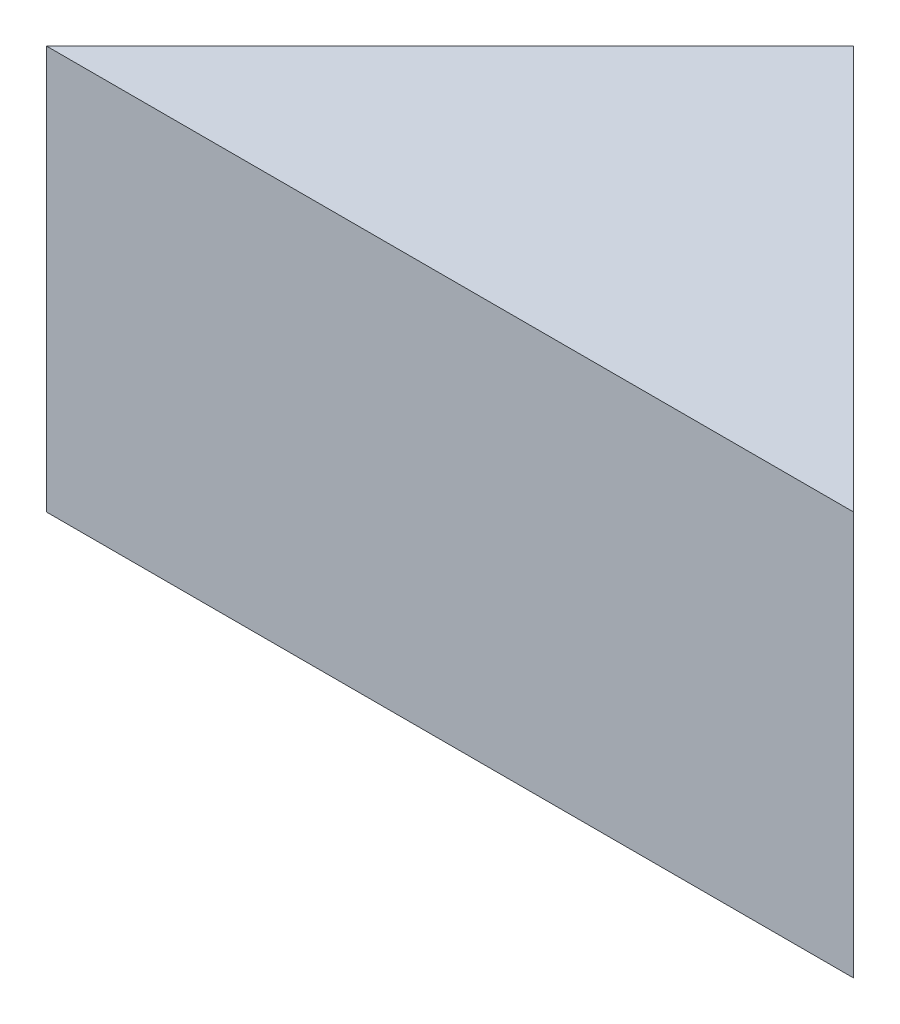
ISO-10303-21;
HEADER;
FILE_DESCRIPTION(('STEP AP214'),'2;1');
FILE_NAME('part.step','',(''),(''),'','','');
FILE_SCHEMA(('AUTOMOTIVE_DESIGN { 1 0 10303 214 1 1 1 1 }'));
ENDSEC;
DATA;
#1=APPLICATION_CONTEXT('core data for automotive mechanical design processes');
#2=APPLICATION_PROTOCOL_DEFINITION('international standard','automotive_design',2000,#1);
#3=PRODUCT_CONTEXT('',#1,'mechanical');
#4=PRODUCT('Part','Part','',(#3));
#5=PRODUCT_RELATED_PRODUCT_CATEGORY('part','',(#4));
#6=PRODUCT_DEFINITION_FORMATION('','',#4);
#7=PRODUCT_DEFINITION_CONTEXT('part definition',#1,'design');
#8=PRODUCT_DEFINITION('design','',#6,#7);
#9=PRODUCT_DEFINITION_SHAPE('','',#8);
#10=(LENGTH_UNIT() NAMED_UNIT(*) SI_UNIT(.MILLI.,.METRE.));
#11=(NAMED_UNIT(*) PLANE_ANGLE_UNIT() SI_UNIT($,.RADIAN.));
#12=(NAMED_UNIT(*) SI_UNIT($,.STERADIAN.) SOLID_ANGLE_UNIT());
#13=UNCERTAINTY_MEASURE_WITH_UNIT(LENGTH_MEASURE(1.E-05),#10,'distance_accuracy_value','');
#14=(GEOMETRIC_REPRESENTATION_CONTEXT(3) GLOBAL_UNCERTAINTY_ASSIGNED_CONTEXT((#13)) GLOBAL_UNIT_ASSIGNED_CONTEXT((#10,
#11,#12)) REPRESENTATION_CONTEXT('',''));
#15=CARTESIAN_POINT('',(0.,0.,0.));
#16=DIRECTION('',(0.,0.,1.));
#17=DIRECTION('',(1.,0.,0.));
#18=AXIS2_PLACEMENT_3D('',#15,#16,#17);
#19=CARTESIAN_POINT('',(0.,20.,0.));
#20=DIRECTION('',(0.,0.,-1.));
#21=DIRECTION('',(-1.,0.,0.));
#22=AXIS2_PLACEMENT_3D('',#19,#20,#21);
#23=PLANE('',#22);
#24=DIRECTION('',(1.,0.,0.));
#25=VECTOR('',#24,1.);
#26=CARTESIAN_POINT('',(0.,0.,0.));
#27=LINE('',#26,#25);
#28=CARTESIAN_POINT('',(-20.,0.,0.));
#29=VERTEX_POINT('',#28);
#30=CARTESIAN_POINT('',(20.,0.,0.));
#31=VERTEX_POINT('',#30);
#32=EDGE_CURVE('E90',#29,#31,#27,.T.);
#33=ORIENTED_EDGE('',*,*,#32,.T.);
#34=DIRECTION('',(0.,-1.,0.));
#35=VECTOR('',#34,1.);
#36=CARTESIAN_POINT('',(20.,20.,0.));
#37=LINE('',#36,#35);
#38=CARTESIAN_POINT('',(20.,20.,0.));
#39=VERTEX_POINT('',#38);
#40=EDGE_CURVE('E11',#39,#31,#37,.T.);
#41=ORIENTED_EDGE('',*,*,#40,.F.);
#42=DIRECTION('',(1.,0.,0.));
#43=VECTOR('',#42,1.);
#44=CARTESIAN_POINT('',(0.,20.,0.));
#45=LINE('',#44,#43);
#46=CARTESIAN_POINT('',(-20.,20.,0.));
#47=VERTEX_POINT('',#46);
#48=EDGE_CURVE('E84',#47,#39,#45,.T.);
#49=ORIENTED_EDGE('',*,*,#48,.F.);
#50=DIRECTION('',(0.,-1.,0.));
#51=VECTOR('',#50,1.);
#52=CARTESIAN_POINT('',(-20.,20.,0.));
#53=LINE('',#52,#51);
#54=EDGE_CURVE('E58',#47,#29,#53,.T.);
#55=ORIENTED_EDGE('',*,*,#54,.T.);
#56=EDGE_LOOP('',(#33,#41,#49,#55));
#57=FACE_BOUND('',#56,.T.);
#58=ADVANCED_FACE('F41',(#57),#23,.F.);
#59=CARTESIAN_POINT('',(9.9999999999999,20.,-10.));
#60=DIRECTION('',(-0.707106781186544,0.,0.707106781186551));
#61=DIRECTION('',(0.707106781186551,0.,0.707106781186544));
#62=AXIS2_PLACEMENT_3D('',#59,#60,#61);
#63=PLANE('',#62);
#64=DIRECTION('',(-0.707106781186551,0.,-0.707106781186544));
#65=VECTOR('',#64,1.);
#66=CARTESIAN_POINT('',(9.9999999999999,0.,-10.));
#67=LINE('',#66,#65);
#68=CARTESIAN_POINT('',(0.,0.,-19.9999999999998));
#69=VERTEX_POINT('',#68);
#70=EDGE_CURVE('E94',#31,#69,#67,.T.);
#71=ORIENTED_EDGE('',*,*,#70,.T.);
#72=DIRECTION('',(0.,-1.,0.));
#73=VECTOR('',#72,1.);
#74=CARTESIAN_POINT('',(0.,20.,-19.9999999999998));
#75=LINE('',#74,#73);
#76=CARTESIAN_POINT('',(0.,20.,-19.9999999999998));
#77=VERTEX_POINT('',#76);
#78=EDGE_CURVE('E50',#77,#69,#75,.T.);
#79=ORIENTED_EDGE('',*,*,#78,.F.);
#80=DIRECTION('',(-0.707106781186551,0.,-0.707106781186544));
#81=VECTOR('',#80,1.);
#82=CARTESIAN_POINT('',(9.9999999999999,20.,-10.));
#83=LINE('',#82,#81);
#84=EDGE_CURVE('E76',#39,#77,#83,.T.);
#85=ORIENTED_EDGE('',*,*,#84,.F.);
#86=ORIENTED_EDGE('',*,*,#40,.T.);
#87=EDGE_LOOP('',(#71,#79,#85,#86));
#88=FACE_BOUND('',#87,.T.);
#89=ADVANCED_FACE('F78',(#88),#63,.F.);
#90=CARTESIAN_POINT('',(-9.9999999999999,20.,-10.));
#91=DIRECTION('',(-0.707106781186544,0.,-0.707106781186551));
#92=DIRECTION('',(-0.707106781186551,0.,0.707106781186544));
#93=AXIS2_PLACEMENT_3D('',#90,#91,#92);
#94=PLANE('',#93);
#95=DIRECTION('',(0.707106781186551,0.,-0.707106781186544));
#96=VECTOR('',#95,1.);
#97=CARTESIAN_POINT('',(-9.9999999999999,0.,-10.));
#98=LINE('',#97,#96);
#99=EDGE_CURVE('E88',#29,#69,#98,.T.);
#100=ORIENTED_EDGE('',*,*,#99,.F.);
#101=ORIENTED_EDGE('',*,*,#54,.F.);
#102=DIRECTION('',(0.707106781186551,0.,-0.707106781186544));
#103=VECTOR('',#102,1.);
#104=CARTESIAN_POINT('',(-9.9999999999999,20.,-10.));
#105=LINE('',#104,#103);
#106=EDGE_CURVE('E83',#47,#77,#105,.T.);
#107=ORIENTED_EDGE('',*,*,#106,.T.);
#108=ORIENTED_EDGE('',*,*,#78,.T.);
#109=EDGE_LOOP('',(#100,#101,#107,#108));
#110=FACE_BOUND('',#109,.T.);
#111=ADVANCED_FACE('F105',(#110),#94,.T.);
#112=CARTESIAN_POINT('',(0.,20.,0.));
#113=DIRECTION('',(0.,1.,0.));
#114=DIRECTION('',(0.,0.,1.));
#115=AXIS2_PLACEMENT_3D('',#112,#113,#114);
#116=PLANE('',#115);
#117=ORIENTED_EDGE('',*,*,#48,.T.);
#118=ORIENTED_EDGE('',*,*,#84,.T.);
#119=ORIENTED_EDGE('',*,*,#106,.F.);
#120=EDGE_LOOP('',(#117,#118,#119));
#121=FACE_BOUND('',#120,.T.);
#122=ADVANCED_FACE('F86',(#121),#116,.T.);
#123=CARTESIAN_POINT('',(0.,0.,0.));
#124=DIRECTION('',(0.,1.,0.));
#125=DIRECTION('',(0.,0.,1.));
#126=AXIS2_PLACEMENT_3D('',#123,#124,#125);
#127=PLANE('',#126);
#128=ORIENTED_EDGE('',*,*,#32,.F.);
#129=ORIENTED_EDGE('',*,*,#99,.T.);
#130=ORIENTED_EDGE('',*,*,#70,.F.);
#131=EDGE_LOOP('',(#128,#129,#130));
#132=FACE_BOUND('',#131,.T.);
#133=ADVANCED_FACE('F112',(#132),#127,.F.);
#134=CLOSED_SHELL('',(#58,#89,#111,#122,#133));
#135=MANIFOLD_SOLID_BREP('B2',#134);
#136=ADVANCED_BREP_SHAPE_REPRESENTATION('',(#18,#135),#14);
#137=SHAPE_DEFINITION_REPRESENTATION(#9,#136);
ENDSEC;
END-ISO-10303-21;
